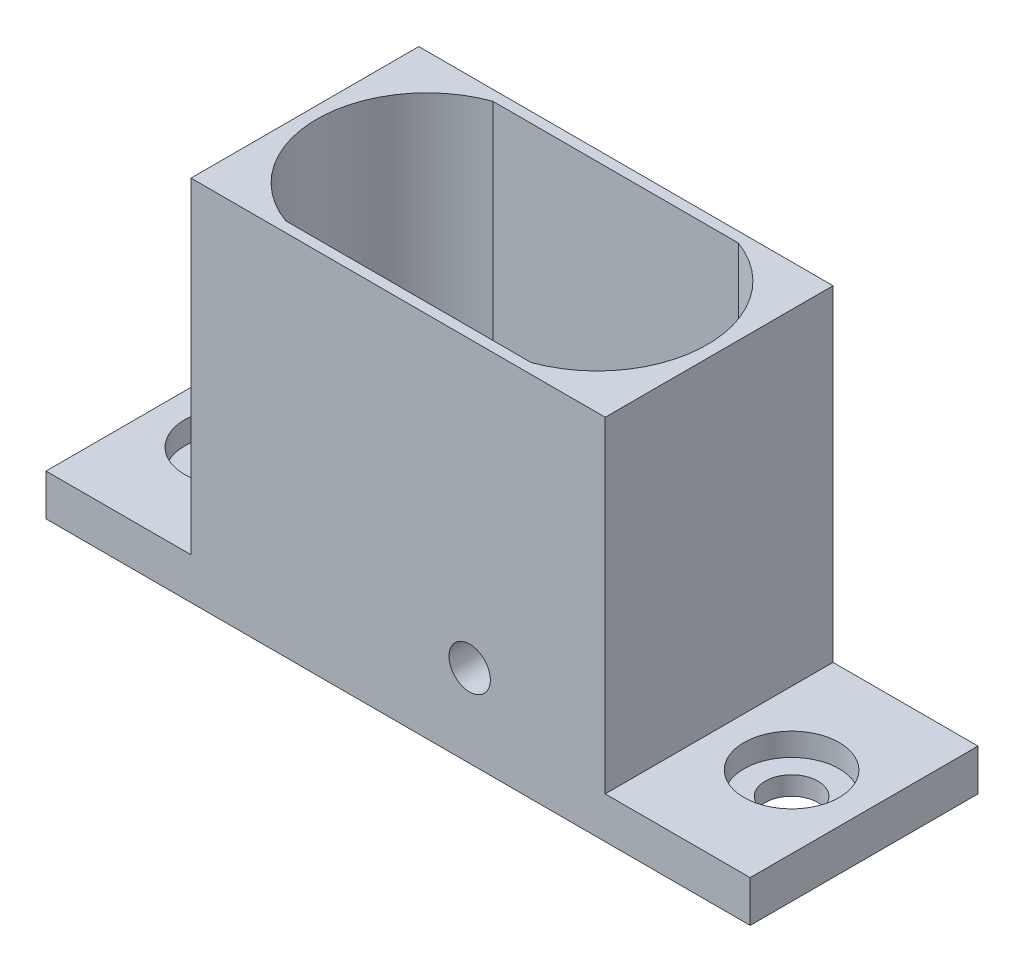
ISO-10303-21;
HEADER;
FILE_DESCRIPTION(('STEP AP214'),'2;1');
FILE_NAME('part.step','',(''),(''),'','','');
FILE_SCHEMA(('AUTOMOTIVE_DESIGN { 1 0 10303 214 1 1 1 1 }'));
ENDSEC;
DATA;
#1=APPLICATION_CONTEXT('core data for automotive mechanical design processes');
#2=APPLICATION_PROTOCOL_DEFINITION('international standard','automotive_design',2000,#1);
#3=PRODUCT_CONTEXT('',#1,'mechanical');
#4=PRODUCT('Part','Part','',(#3));
#5=PRODUCT_RELATED_PRODUCT_CATEGORY('part','',(#4));
#6=PRODUCT_DEFINITION_FORMATION('','',#4);
#7=PRODUCT_DEFINITION_CONTEXT('part definition',#1,'design');
#8=PRODUCT_DEFINITION('design','',#6,#7);
#9=PRODUCT_DEFINITION_SHAPE('','',#8);
#10=(LENGTH_UNIT() NAMED_UNIT(*) SI_UNIT(.MILLI.,.METRE.));
#11=(NAMED_UNIT(*) PLANE_ANGLE_UNIT() SI_UNIT($,.RADIAN.));
#12=(NAMED_UNIT(*) SI_UNIT($,.STERADIAN.) SOLID_ANGLE_UNIT());
#13=UNCERTAINTY_MEASURE_WITH_UNIT(LENGTH_MEASURE(1.E-05),#10,'distance_accuracy_value','');
#14=(GEOMETRIC_REPRESENTATION_CONTEXT(3) GLOBAL_UNCERTAINTY_ASSIGNED_CONTEXT((#13)) GLOBAL_UNIT_ASSIGNED_CONTEXT((#10,
#11,#12)) REPRESENTATION_CONTEXT('',''));
#15=CARTESIAN_POINT('',(0.,0.,0.));
#16=DIRECTION('',(0.,0.,1.));
#17=DIRECTION('',(1.,0.,0.));
#18=AXIS2_PLACEMENT_3D('',#15,#16,#17);
#19=CARTESIAN_POINT('',(6.91,-9.77,16.6568542494924));
#20=DIRECTION('',(0.,0.,-1.));
#21=DIRECTION('',(-1.,0.,0.));
#22=AXIS2_PLACEMENT_3D('',#19,#20,#21);
#23=CYLINDRICAL_SURFACE('',#22,2.);
#24=CARTESIAN_POINT('',(6.91,-9.77,-4.6));
#25=DIRECTION('',(0.,0.,1.));
#26=DIRECTION('',(1.,0.,0.));
#27=AXIS2_PLACEMENT_3D('',#24,#25,#26);
#28=CIRCLE('',#27,2.);
#29=CARTESIAN_POINT('',(8.91,-9.77,-4.6));
#30=VERTEX_POINT('',#29);
#31=EDGE_CURVE('E353',#30,#30,#28,.T.);
#32=ORIENTED_EDGE('',*,*,#31,.T.);
#33=EDGE_LOOP('',(#32));
#34=FACE_BOUND('',#33,.T.);
#35=CARTESIAN_POINT('',(6.91,-9.77,-8.5));
#36=DIRECTION('',(0.,0.,-1.));
#37=DIRECTION('',(-1.,0.,0.));
#38=AXIS2_PLACEMENT_3D('',#35,#36,#37);
#39=CIRCLE('',#38,2.);
#40=CARTESIAN_POINT('',(4.91,-9.77,-8.5));
#41=VERTEX_POINT('',#40);
#42=EDGE_CURVE('E91',#41,#41,#39,.F.);
#43=ORIENTED_EDGE('',*,*,#42,.F.);
#44=EDGE_LOOP('',(#43));
#45=FACE_BOUND('',#44,.T.);
#46=ADVANCED_FACE('F87',(#34,#45),#23,.F.);
#47=CARTESIAN_POINT('',(0.,17.75,0.));
#48=DIRECTION('',(0.,1.,0.));
#49=DIRECTION('',(0.,0.,1.));
#50=AXIS2_PLACEMENT_3D('',#47,#48,#49);
#51=PLANE('',#50);
#52=DIRECTION('',(0.,0.,-1.));
#53=VECTOR('',#52,1.);
#54=CARTESIAN_POINT('',(-20.,17.75,0.));
#55=LINE('',#54,#53);
#56=CARTESIAN_POINT('',(-20.,17.75,11.));
#57=VERTEX_POINT('',#56);
#58=CARTESIAN_POINT('',(-20.,17.75,-11.));
#59=VERTEX_POINT('',#58);
#60=EDGE_CURVE('E294',#57,#59,#55,.T.);
#61=ORIENTED_EDGE('',*,*,#60,.F.);
#62=DIRECTION('',(1.,0.,0.));
#63=VECTOR('',#62,1.);
#64=CARTESIAN_POINT('',(0.,17.75,11.));
#65=LINE('',#64,#63);
#66=CARTESIAN_POINT('',(20.,17.75,11.));
#67=VERTEX_POINT('',#66);
#68=EDGE_CURVE('E326',#57,#67,#65,.T.);
#69=ORIENTED_EDGE('',*,*,#68,.T.);
#70=DIRECTION('',(0.,0.,-1.));
#71=VECTOR('',#70,1.);
#72=CARTESIAN_POINT('',(20.,17.75,0.));
#73=LINE('',#72,#71);
#74=CARTESIAN_POINT('',(20.,17.75,-11.));
#75=VERTEX_POINT('',#74);
#76=EDGE_CURVE('E280',#67,#75,#73,.T.);
#77=ORIENTED_EDGE('',*,*,#76,.T.);
#78=DIRECTION('',(1.,0.,0.));
#79=VECTOR('',#78,1.);
#80=CARTESIAN_POINT('',(0.,17.75,-11.));
#81=LINE('',#80,#79);
#82=EDGE_CURVE('E329',#59,#75,#81,.T.);
#83=ORIENTED_EDGE('',*,*,#82,.F.);
#84=EDGE_LOOP('',(#61,#69,#77,#83));
#85=FACE_BOUND('',#84,.T.);
#86=CARTESIAN_POINT('',(8.22,17.75,0.));
#87=DIRECTION('',(0.,1.,0.));
#88=DIRECTION('',(0.,0.,1.));
#89=AXIS2_PLACEMENT_3D('',#86,#87,#88);
#90=CIRCLE('',#89,10.64);
#91=CARTESIAN_POINT('',(11.8545013413122,17.75,10.));
#92=VERTEX_POINT('',#91);
#93=CARTESIAN_POINT('',(11.8545013413122,17.75,-10.));
#94=VERTEX_POINT('',#93);
#95=EDGE_CURVE('E245',#92,#94,#90,.T.);
#96=ORIENTED_EDGE('',*,*,#95,.F.);
#97=DIRECTION('',(-1.,0.,0.));
#98=VECTOR('',#97,1.);
#99=CARTESIAN_POINT('',(0.,17.75,9.99999999999999));
#100=LINE('',#99,#98);
#101=CARTESIAN_POINT('',(-11.8545013413122,17.75,9.99999999999999));
#102=VERTEX_POINT('',#101);
#103=EDGE_CURVE('E112',#92,#102,#100,.T.);
#104=ORIENTED_EDGE('',*,*,#103,.T.);
#105=CARTESIAN_POINT('',(-8.22,17.75,0.));
#106=DIRECTION('',(0.,1.,0.));
#107=DIRECTION('',(0.,0.,1.));
#108=AXIS2_PLACEMENT_3D('',#105,#106,#107);
#109=CIRCLE('',#108,10.64);
#110=CARTESIAN_POINT('',(-11.8545013413122,17.75,-10.));
#111=VERTEX_POINT('',#110);
#112=EDGE_CURVE('E256',#111,#102,#109,.T.);
#113=ORIENTED_EDGE('',*,*,#112,.F.);
#114=DIRECTION('',(-1.,0.,0.));
#115=VECTOR('',#114,1.);
#116=CARTESIAN_POINT('',(0.,17.75,-10.));
#117=LINE('',#116,#115);
#118=EDGE_CURVE('E259',#94,#111,#117,.T.);
#119=ORIENTED_EDGE('',*,*,#118,.F.);
#120=EDGE_LOOP('',(#96,#104,#113,#119));
#121=FACE_BOUND('',#120,.T.);
#122=ADVANCED_FACE('F394',(#85,#121),#51,.T.);
#123=CARTESIAN_POINT('',(-27.,17.75,0.));
#124=DIRECTION('',(0.,-1.,0.));
#125=DIRECTION('',(0.,0.,-1.));
#126=AXIS2_PLACEMENT_3D('',#123,#124,#125);
#127=CYLINDRICAL_SURFACE('',#126,2.55);
#128=CARTESIAN_POINT('',(-27.,-17.75,0.));
#129=DIRECTION('',(0.,1.,0.));
#130=DIRECTION('',(0.,0.,1.));
#131=AXIS2_PLACEMENT_3D('',#128,#129,#130);
#132=CIRCLE('',#131,2.55);
#133=CARTESIAN_POINT('',(-27.,-17.75,2.55));
#134=VERTEX_POINT('',#133);
#135=EDGE_CURVE('E345',#134,#134,#132,.T.);
#136=ORIENTED_EDGE('',*,*,#135,.F.);
#137=EDGE_LOOP('',(#136));
#138=FACE_BOUND('',#137,.T.);
#139=CARTESIAN_POINT('',(-27.,-15.95,0.));
#140=DIRECTION('',(0.,1.,0.));
#141=DIRECTION('',(0.,0.,1.));
#142=AXIS2_PLACEMENT_3D('',#139,#140,#141);
#143=CIRCLE('',#142,2.55);
#144=CARTESIAN_POINT('',(-27.,-15.95,2.55));
#145=VERTEX_POINT('',#144);
#146=EDGE_CURVE('E272',#145,#145,#143,.T.);
#147=ORIENTED_EDGE('',*,*,#146,.T.);
#148=EDGE_LOOP('',(#147));
#149=FACE_BOUND('',#148,.T.);
#150=ADVANCED_FACE('F441',(#138,#149),#127,.F.);
#151=CARTESIAN_POINT('',(27.,17.75,0.));
#152=DIRECTION('',(0.,-1.,0.));
#153=DIRECTION('',(0.,0.,-1.));
#154=AXIS2_PLACEMENT_3D('',#151,#152,#153);
#155=CYLINDRICAL_SURFACE('',#154,2.55);
#156=CARTESIAN_POINT('',(27.,-17.75,0.));
#157=DIRECTION('',(0.,1.,0.));
#158=DIRECTION('',(0.,0.,1.));
#159=AXIS2_PLACEMENT_3D('',#156,#157,#158);
#160=CIRCLE('',#159,2.55);
#161=CARTESIAN_POINT('',(27.,-17.75,2.55));
#162=VERTEX_POINT('',#161);
#163=EDGE_CURVE('E330',#162,#162,#160,.F.);
#164=ORIENTED_EDGE('',*,*,#163,.T.);
#165=EDGE_LOOP('',(#164));
#166=FACE_BOUND('',#165,.T.);
#167=CARTESIAN_POINT('',(27.,-15.95,0.));
#168=DIRECTION('',(0.,1.,0.));
#169=DIRECTION('',(0.,0.,1.));
#170=AXIS2_PLACEMENT_3D('',#167,#168,#169);
#171=CIRCLE('',#170,2.55);
#172=CARTESIAN_POINT('',(27.,-15.95,2.55));
#173=VERTEX_POINT('',#172);
#174=EDGE_CURVE('E271',#173,#173,#171,.T.);
#175=ORIENTED_EDGE('',*,*,#174,.T.);
#176=EDGE_LOOP('',(#175));
#177=FACE_BOUND('',#176,.T.);
#178=ADVANCED_FACE('F624',(#166,#177),#155,.F.);
#179=CARTESIAN_POINT('',(0.,17.75,11.));
#180=DIRECTION('',(0.,0.,-1.));
#181=DIRECTION('',(-1.,0.,0.));
#182=AXIS2_PLACEMENT_3D('',#179,#180,#181);
#183=PLANE('',#182);
#184=CARTESIAN_POINT('',(6.91,-9.77,11.));
#185=DIRECTION('',(0.,0.,-1.));
#186=DIRECTION('',(-1.,0.,0.));
#187=AXIS2_PLACEMENT_3D('',#184,#185,#186);
#188=CIRCLE('',#187,2.);
#189=CARTESIAN_POINT('',(4.91,-9.77,11.));
#190=VERTEX_POINT('',#189);
#191=EDGE_CURVE('E355',#190,#190,#188,.F.);
#192=ORIENTED_EDGE('',*,*,#191,.F.);
#193=EDGE_LOOP('',(#192));
#194=FACE_BOUND('',#193,.T.);
#195=ORIENTED_EDGE('',*,*,#68,.F.);
#196=DIRECTION('',(0.,1.,0.));
#197=VECTOR('',#196,1.);
#198=CARTESIAN_POINT('',(-20.,-13.75,11.));
#199=LINE('',#198,#197);
#200=CARTESIAN_POINT('',(-20.,-13.75,11.));
#201=VERTEX_POINT('',#200);
#202=EDGE_CURVE('E301',#201,#57,#199,.T.);
#203=ORIENTED_EDGE('',*,*,#202,.F.);
#204=DIRECTION('',(-1.,0.,0.));
#205=VECTOR('',#204,1.);
#206=CARTESIAN_POINT('',(0.,-13.75,11.));
#207=LINE('',#206,#205);
#208=CARTESIAN_POINT('',(-34.,-13.75,11.));
#209=VERTEX_POINT('',#208);
#210=EDGE_CURVE('E290',#201,#209,#207,.T.);
#211=ORIENTED_EDGE('',*,*,#210,.T.);
#212=DIRECTION('',(0.,-1.,0.));
#213=VECTOR('',#212,1.);
#214=CARTESIAN_POINT('',(-34.,17.75,11.));
#215=LINE('',#214,#213);
#216=CARTESIAN_POINT('',(-34.,-17.75,11.));
#217=VERTEX_POINT('',#216);
#218=EDGE_CURVE('E333',#209,#217,#215,.T.);
#219=ORIENTED_EDGE('',*,*,#218,.T.);
#220=DIRECTION('',(1.,0.,0.));
#221=VECTOR('',#220,1.);
#222=CARTESIAN_POINT('',(0.,-17.75,11.));
#223=LINE('',#222,#221);
#224=CARTESIAN_POINT('',(34.,-17.75,11.));
#225=VERTEX_POINT('',#224);
#226=EDGE_CURVE('E308',#217,#225,#223,.T.);
#227=ORIENTED_EDGE('',*,*,#226,.T.);
#228=DIRECTION('',(0.,-1.,0.));
#229=VECTOR('',#228,1.);
#230=CARTESIAN_POINT('',(34.,17.75,11.));
#231=LINE('',#230,#229);
#232=CARTESIAN_POINT('',(34.,-13.75,11.));
#233=VERTEX_POINT('',#232);
#234=EDGE_CURVE('E12',#233,#225,#231,.T.);
#235=ORIENTED_EDGE('',*,*,#234,.F.);
#236=DIRECTION('',(-1.,0.,0.));
#237=VECTOR('',#236,1.);
#238=CARTESIAN_POINT('',(0.,-13.75,11.));
#239=LINE('',#238,#237);
#240=CARTESIAN_POINT('',(20.,-13.75,11.));
#241=VERTEX_POINT('',#240);
#242=EDGE_CURVE('E317',#233,#241,#239,.T.);
#243=ORIENTED_EDGE('',*,*,#242,.T.);
#244=DIRECTION('',(0.,1.,0.));
#245=VECTOR('',#244,1.);
#246=CARTESIAN_POINT('',(20.,-13.75,11.));
#247=LINE('',#246,#245);
#248=EDGE_CURVE('E320',#241,#67,#247,.T.);
#249=ORIENTED_EDGE('',*,*,#248,.T.);
#250=EDGE_LOOP('',(#195,#203,#211,#219,#227,#235,#243,#249));
#251=FACE_BOUND('',#250,.T.);
#252=ADVANCED_FACE('F89',(#194,#251),#183,.F.);
#253=CARTESIAN_POINT('',(34.,17.75,0.));
#254=DIRECTION('',(-1.,0.,0.));
#255=DIRECTION('',(0.,0.,1.));
#256=AXIS2_PLACEMENT_3D('',#253,#254,#255);
#257=PLANE('',#256);
#258=DIRECTION('',(0.,0.,1.));
#259=VECTOR('',#258,1.);
#260=CARTESIAN_POINT('',(34.,-13.75,0.));
#261=LINE('',#260,#259);
#262=CARTESIAN_POINT('',(34.,-13.75,-11.));
#263=VERTEX_POINT('',#262);
#264=EDGE_CURVE('E314',#263,#233,#261,.T.);
#265=ORIENTED_EDGE('',*,*,#264,.T.);
#266=ORIENTED_EDGE('',*,*,#234,.T.);
#267=DIRECTION('',(0.,0.,-1.));
#268=VECTOR('',#267,1.);
#269=CARTESIAN_POINT('',(34.,-17.75,0.));
#270=LINE('',#269,#268);
#271=CARTESIAN_POINT('',(34.,-17.75,-11.));
#272=VERTEX_POINT('',#271);
#273=EDGE_CURVE('E336',#225,#272,#270,.T.);
#274=ORIENTED_EDGE('',*,*,#273,.T.);
#275=DIRECTION('',(0.,-1.,0.));
#276=VECTOR('',#275,1.);
#277=CARTESIAN_POINT('',(34.,17.75,-11.));
#278=LINE('',#277,#276);
#279=EDGE_CURVE('E96',#263,#272,#278,.T.);
#280=ORIENTED_EDGE('',*,*,#279,.F.);
#281=EDGE_LOOP('',(#265,#266,#274,#280));
#282=FACE_BOUND('',#281,.T.);
#283=ADVANCED_FACE('F384',(#282),#257,.F.);
#284=CARTESIAN_POINT('',(0.,17.75,-11.));
#285=DIRECTION('',(0.,0.,-1.));
#286=DIRECTION('',(-1.,0.,0.));
#287=AXIS2_PLACEMENT_3D('',#284,#285,#286);
#288=PLANE('',#287);
#289=CARTESIAN_POINT('',(6.91,-9.77,-11.));
#290=DIRECTION('',(0.,0.,-1.));
#291=DIRECTION('',(-1.,0.,0.));
#292=AXIS2_PLACEMENT_3D('',#289,#290,#291);
#293=CIRCLE('',#292,4.125);
#294=CARTESIAN_POINT('',(2.785,-9.77,-11.));
#295=VERTEX_POINT('',#294);
#296=EDGE_CURVE('E365',#295,#295,#293,.T.);
#297=ORIENTED_EDGE('',*,*,#296,.F.);
#298=EDGE_LOOP('',(#297));
#299=FACE_BOUND('',#298,.T.);
#300=DIRECTION('',(0.,1.,0.));
#301=VECTOR('',#300,1.);
#302=CARTESIAN_POINT('',(-20.,-13.75,-11.));
#303=LINE('',#302,#301);
#304=CARTESIAN_POINT('',(-20.,-13.75,-11.));
#305=VERTEX_POINT('',#304);
#306=EDGE_CURVE('E305',#305,#59,#303,.T.);
#307=ORIENTED_EDGE('',*,*,#306,.T.);
#308=ORIENTED_EDGE('',*,*,#82,.T.);
#309=DIRECTION('',(0.,1.,0.));
#310=VECTOR('',#309,1.);
#311=CARTESIAN_POINT('',(20.,-13.75,-11.));
#312=LINE('',#311,#310);
#313=CARTESIAN_POINT('',(20.,-13.75,-11.));
#314=VERTEX_POINT('',#313);
#315=EDGE_CURVE('E303',#314,#75,#312,.T.);
#316=ORIENTED_EDGE('',*,*,#315,.F.);
#317=DIRECTION('',(-1.,0.,0.));
#318=VECTOR('',#317,1.);
#319=CARTESIAN_POINT('',(0.,-13.75,-11.));
#320=LINE('',#319,#318);
#321=EDGE_CURVE('E311',#263,#314,#320,.T.);
#322=ORIENTED_EDGE('',*,*,#321,.F.);
#323=ORIENTED_EDGE('',*,*,#279,.T.);
#324=DIRECTION('',(1.,0.,0.));
#325=VECTOR('',#324,1.);
#326=CARTESIAN_POINT('',(0.,-17.75,-11.));
#327=LINE('',#326,#325);
#328=CARTESIAN_POINT('',(-34.,-17.75,-11.));
#329=VERTEX_POINT('',#328);
#330=EDGE_CURVE('E339',#329,#272,#327,.T.);
#331=ORIENTED_EDGE('',*,*,#330,.F.);
#332=DIRECTION('',(0.,-1.,0.));
#333=VECTOR('',#332,1.);
#334=CARTESIAN_POINT('',(-34.,17.75,-11.));
#335=LINE('',#334,#333);
#336=CARTESIAN_POINT('',(-34.,-13.75,-11.));
#337=VERTEX_POINT('',#336);
#338=EDGE_CURVE('E351',#337,#329,#335,.T.);
#339=ORIENTED_EDGE('',*,*,#338,.F.);
#340=DIRECTION('',(-1.,0.,0.));
#341=VECTOR('',#340,1.);
#342=CARTESIAN_POINT('',(0.,-13.75,-11.));
#343=LINE('',#342,#341);
#344=EDGE_CURVE('E296',#305,#337,#343,.T.);
#345=ORIENTED_EDGE('',*,*,#344,.F.);
#346=EDGE_LOOP('',(#307,#308,#316,#322,#323,#331,#339,#345));
#347=FACE_BOUND('',#346,.T.);
#348=ADVANCED_FACE('F380',(#299,#347),#288,.T.);
#349=CARTESIAN_POINT('',(-34.,17.75,0.));
#350=DIRECTION('',(-1.,0.,0.));
#351=DIRECTION('',(0.,0.,1.));
#352=AXIS2_PLACEMENT_3D('',#349,#350,#351);
#353=PLANE('',#352);
#354=ORIENTED_EDGE('',*,*,#218,.F.);
#355=DIRECTION('',(0.,0.,1.));
#356=VECTOR('',#355,1.);
#357=CARTESIAN_POINT('',(-34.,-13.75,0.));
#358=LINE('',#357,#356);
#359=EDGE_CURVE('E293',#337,#209,#358,.T.);
#360=ORIENTED_EDGE('',*,*,#359,.F.);
#361=ORIENTED_EDGE('',*,*,#338,.T.);
#362=DIRECTION('',(0.,0.,-1.));
#363=VECTOR('',#362,1.);
#364=CARTESIAN_POINT('',(-34.,-17.75,0.));
#365=LINE('',#364,#363);
#366=EDGE_CURVE('E342',#217,#329,#365,.T.);
#367=ORIENTED_EDGE('',*,*,#366,.F.);
#368=EDGE_LOOP('',(#354,#360,#361,#367));
#369=FACE_BOUND('',#368,.T.);
#370=ADVANCED_FACE('F383',(#369),#353,.T.);
#371=CARTESIAN_POINT('',(0.,-17.75,0.));
#372=DIRECTION('',(0.,1.,0.));
#373=DIRECTION('',(0.,0.,1.));
#374=AXIS2_PLACEMENT_3D('',#371,#372,#373);
#375=PLANE('',#374);
#376=ORIENTED_EDGE('',*,*,#226,.F.);
#377=ORIENTED_EDGE('',*,*,#366,.T.);
#378=ORIENTED_EDGE('',*,*,#330,.T.);
#379=ORIENTED_EDGE('',*,*,#273,.F.);
#380=EDGE_LOOP('',(#376,#377,#378,#379));
#381=FACE_BOUND('',#380,.T.);
#382=ORIENTED_EDGE('',*,*,#135,.T.);
#383=EDGE_LOOP('',(#382));
#384=FACE_BOUND('',#383,.T.);
#385=ORIENTED_EDGE('',*,*,#163,.F.);
#386=EDGE_LOOP('',(#385));
#387=FACE_BOUND('',#386,.T.);
#388=ADVANCED_FACE('F413',(#381,#384,#387),#375,.F.);
#389=CARTESIAN_POINT('',(20.,-13.75,0.));
#390=DIRECTION('',(1.,0.,0.));
#391=DIRECTION('',(0.,0.,-1.));
#392=AXIS2_PLACEMENT_3D('',#389,#390,#391);
#393=PLANE('',#392);
#394=ORIENTED_EDGE('',*,*,#76,.F.);
#395=ORIENTED_EDGE('',*,*,#248,.F.);
#396=DIRECTION('',(0.,0.,-1.));
#397=VECTOR('',#396,1.);
#398=CARTESIAN_POINT('',(20.,-13.75,0.));
#399=LINE('',#398,#397);
#400=EDGE_CURVE('E309',#241,#314,#399,.T.);
#401=ORIENTED_EDGE('',*,*,#400,.T.);
#402=ORIENTED_EDGE('',*,*,#315,.T.);
#403=EDGE_LOOP('',(#394,#395,#401,#402));
#404=FACE_BOUND('',#403,.T.);
#405=ADVANCED_FACE('F398',(#404),#393,.T.);
#406=CARTESIAN_POINT('',(0.,-13.75,0.));
#407=DIRECTION('',(0.,1.,0.));
#408=DIRECTION('',(0.,0.,1.));
#409=AXIS2_PLACEMENT_3D('',#406,#407,#408);
#410=PLANE('',#409);
#411=CARTESIAN_POINT('',(27.,-13.75,0.));
#412=DIRECTION('',(0.,1.,0.));
#413=DIRECTION('',(0.,0.,1.));
#414=AXIS2_PLACEMENT_3D('',#411,#412,#413);
#415=CIRCLE('',#414,4.6);
#416=CARTESIAN_POINT('',(27.,-13.75,4.6));
#417=VERTEX_POINT('',#416);
#418=EDGE_CURVE('E285',#417,#417,#415,.T.);
#419=ORIENTED_EDGE('',*,*,#418,.F.);
#420=EDGE_LOOP('',(#419));
#421=FACE_BOUND('',#420,.T.);
#422=ORIENTED_EDGE('',*,*,#400,.F.);
#423=ORIENTED_EDGE('',*,*,#242,.F.);
#424=ORIENTED_EDGE('',*,*,#264,.F.);
#425=ORIENTED_EDGE('',*,*,#321,.T.);
#426=EDGE_LOOP('',(#422,#423,#424,#425));
#427=FACE_BOUND('',#426,.T.);
#428=ADVANCED_FACE('F404',(#421,#427),#410,.T.);
#429=CARTESIAN_POINT('',(-20.,-13.75,0.));
#430=DIRECTION('',(1.,0.,0.));
#431=DIRECTION('',(0.,0.,-1.));
#432=AXIS2_PLACEMENT_3D('',#429,#430,#431);
#433=PLANE('',#432);
#434=ORIENTED_EDGE('',*,*,#60,.T.);
#435=ORIENTED_EDGE('',*,*,#306,.F.);
#436=DIRECTION('',(0.,0.,-1.));
#437=VECTOR('',#436,1.);
#438=CARTESIAN_POINT('',(-20.,-13.75,0.));
#439=LINE('',#438,#437);
#440=EDGE_CURVE('E298',#201,#305,#439,.T.);
#441=ORIENTED_EDGE('',*,*,#440,.F.);
#442=ORIENTED_EDGE('',*,*,#202,.T.);
#443=EDGE_LOOP('',(#434,#435,#441,#442));
#444=FACE_BOUND('',#443,.T.);
#445=ADVANCED_FACE('F420',(#444),#433,.F.);
#446=CARTESIAN_POINT('',(0.,-13.75,0.));
#447=DIRECTION('',(0.,1.,0.));
#448=DIRECTION('',(0.,0.,1.));
#449=AXIS2_PLACEMENT_3D('',#446,#447,#448);
#450=PLANE('',#449);
#451=CARTESIAN_POINT('',(-27.,-13.75,0.));
#452=DIRECTION('',(0.,1.,0.));
#453=DIRECTION('',(0.,0.,1.));
#454=AXIS2_PLACEMENT_3D('',#451,#452,#453);
#455=CIRCLE('',#454,4.6);
#456=CARTESIAN_POINT('',(-27.,-13.75,4.6));
#457=VERTEX_POINT('',#456);
#458=EDGE_CURVE('E275',#457,#457,#455,.T.);
#459=ORIENTED_EDGE('',*,*,#458,.F.);
#460=EDGE_LOOP('',(#459));
#461=FACE_BOUND('',#460,.T.);
#462=ORIENTED_EDGE('',*,*,#210,.F.);
#463=ORIENTED_EDGE('',*,*,#440,.T.);
#464=ORIENTED_EDGE('',*,*,#344,.T.);
#465=ORIENTED_EDGE('',*,*,#359,.T.);
#466=EDGE_LOOP('',(#462,#463,#464,#465));
#467=FACE_BOUND('',#466,.T.);
#468=ADVANCED_FACE('F419',(#461,#467),#450,.T.);
#469=CARTESIAN_POINT('',(-27.,-15.95,0.));
#470=DIRECTION('',(0.,1.,0.));
#471=DIRECTION('',(0.,0.,1.));
#472=AXIS2_PLACEMENT_3D('',#469,#470,#471);
#473=CYLINDRICAL_SURFACE('',#472,4.6);
#474=CARTESIAN_POINT('',(-27.,-15.95,0.));
#475=DIRECTION('',(0.,1.,0.));
#476=DIRECTION('',(0.,0.,1.));
#477=AXIS2_PLACEMENT_3D('',#474,#475,#476);
#478=CIRCLE('',#477,4.6);
#479=CARTESIAN_POINT('',(-27.,-15.95,4.6));
#480=VERTEX_POINT('',#479);
#481=EDGE_CURVE('E277',#480,#480,#478,.T.);
#482=ORIENTED_EDGE('',*,*,#481,.F.);
#483=EDGE_LOOP('',(#482));
#484=FACE_BOUND('',#483,.T.);
#485=ORIENTED_EDGE('',*,*,#458,.T.);
#486=EDGE_LOOP('',(#485));
#487=FACE_BOUND('',#486,.T.);
#488=ADVANCED_FACE('F428',(#484,#487),#473,.F.);
#489=CARTESIAN_POINT('',(-27.,-15.95,0.));
#490=DIRECTION('',(0.,1.,0.));
#491=DIRECTION('',(0.,0.,1.));
#492=AXIS2_PLACEMENT_3D('',#489,#490,#491);
#493=PLANE('',#492);
#494=ORIENTED_EDGE('',*,*,#146,.F.);
#495=EDGE_LOOP('',(#494));
#496=FACE_BOUND('',#495,.T.);
#497=ORIENTED_EDGE('',*,*,#481,.T.);
#498=EDGE_LOOP('',(#497));
#499=FACE_BOUND('',#498,.T.);
#500=ADVANCED_FACE('F492',(#496,#499),#493,.T.);
#501=CARTESIAN_POINT('',(27.,-15.95,0.));
#502=DIRECTION('',(0.,1.,0.));
#503=DIRECTION('',(0.,0.,1.));
#504=AXIS2_PLACEMENT_3D('',#501,#502,#503);
#505=CYLINDRICAL_SURFACE('',#504,4.6);
#506=CARTESIAN_POINT('',(27.,-15.95,0.));
#507=DIRECTION('',(0.,1.,0.));
#508=DIRECTION('',(0.,0.,1.));
#509=AXIS2_PLACEMENT_3D('',#506,#507,#508);
#510=CIRCLE('',#509,4.6);
#511=CARTESIAN_POINT('',(27.,-15.95,4.6));
#512=VERTEX_POINT('',#511);
#513=EDGE_CURVE('E276',#512,#512,#510,.T.);
#514=ORIENTED_EDGE('',*,*,#513,.F.);
#515=EDGE_LOOP('',(#514));
#516=FACE_BOUND('',#515,.T.);
#517=ORIENTED_EDGE('',*,*,#418,.T.);
#518=EDGE_LOOP('',(#517));
#519=FACE_BOUND('',#518,.T.);
#520=ADVANCED_FACE('F495',(#516,#519),#505,.F.);
#521=CARTESIAN_POINT('',(27.,-15.95,0.));
#522=DIRECTION('',(0.,1.,0.));
#523=DIRECTION('',(0.,0.,1.));
#524=AXIS2_PLACEMENT_3D('',#521,#522,#523);
#525=PLANE('',#524);
#526=ORIENTED_EDGE('',*,*,#174,.F.);
#527=EDGE_LOOP('',(#526));
#528=FACE_BOUND('',#527,.T.);
#529=ORIENTED_EDGE('',*,*,#513,.T.);
#530=EDGE_LOOP('',(#529));
#531=FACE_BOUND('',#530,.T.);
#532=ADVANCED_FACE('F491',(#528,#531),#525,.T.);
#533=CARTESIAN_POINT('',(0.,-5.25,9.99999999999999));
#534=DIRECTION('',(0.,0.,-1.));
#535=DIRECTION('',(-1.,0.,0.));
#536=AXIS2_PLACEMENT_3D('',#533,#534,#535);
#537=PLANE('',#536);
#538=ORIENTED_EDGE('',*,*,#103,.F.);
#539=DIRECTION('',(0.,1.,0.));
#540=VECTOR('',#539,1.);
#541=CARTESIAN_POINT('',(11.8545013413122,-5.25,10.));
#542=LINE('',#541,#540);
#543=CARTESIAN_POINT('',(11.8545013413122,-5.25,10.));
#544=VERTEX_POINT('',#543);
#545=EDGE_CURVE('E254',#544,#92,#542,.T.);
#546=ORIENTED_EDGE('',*,*,#545,.F.);
#547=DIRECTION('',(-1.,0.,0.));
#548=VECTOR('',#547,1.);
#549=CARTESIAN_POINT('',(0.,-5.25,9.99999999999999));
#550=LINE('',#549,#548);
#551=CARTESIAN_POINT('',(-11.8545013413122,-5.25,9.99999999999999));
#552=VERTEX_POINT('',#551);
#553=EDGE_CURVE('E242',#544,#552,#550,.T.);
#554=ORIENTED_EDGE('',*,*,#553,.T.);
#555=DIRECTION('',(0.,1.,0.));
#556=VECTOR('',#555,1.);
#557=CARTESIAN_POINT('',(-11.8545013413122,-5.25,9.99999999999999));
#558=LINE('',#557,#556);
#559=EDGE_CURVE('E269',#552,#102,#558,.T.);
#560=ORIENTED_EDGE('',*,*,#559,.T.);
#561=EDGE_LOOP('',(#538,#546,#554,#560));
#562=FACE_BOUND('',#561,.T.);
#563=ADVANCED_FACE('F487',(#562),#537,.T.);
#564=CARTESIAN_POINT('',(-8.22,-5.25,0.));
#565=DIRECTION('',(0.,1.,0.));
#566=DIRECTION('',(0.,0.,1.));
#567=AXIS2_PLACEMENT_3D('',#564,#565,#566);
#568=CYLINDRICAL_SURFACE('',#567,10.64);
#569=ORIENTED_EDGE('',*,*,#112,.T.);
#570=ORIENTED_EDGE('',*,*,#559,.F.);
#571=CARTESIAN_POINT('',(-8.22,-5.25,0.));
#572=DIRECTION('',(0.,1.,0.));
#573=DIRECTION('',(0.,0.,1.));
#574=AXIS2_PLACEMENT_3D('',#571,#572,#573);
#575=CIRCLE('',#574,10.64);
#576=CARTESIAN_POINT('',(-11.8545013413122,-5.25,-10.));
#577=VERTEX_POINT('',#576);
#578=EDGE_CURVE('E244',#577,#552,#575,.T.);
#579=ORIENTED_EDGE('',*,*,#578,.F.);
#580=DIRECTION('',(0.,1.,0.));
#581=VECTOR('',#580,1.);
#582=CARTESIAN_POINT('',(-11.8545013413122,-5.25,-10.));
#583=LINE('',#582,#581);
#584=EDGE_CURVE('E267',#577,#111,#583,.T.);
#585=ORIENTED_EDGE('',*,*,#584,.T.);
#586=EDGE_LOOP('',(#569,#570,#579,#585));
#587=FACE_BOUND('',#586,.T.);
#588=ADVANCED_FACE('F483',(#587),#568,.F.);
#589=CARTESIAN_POINT('',(0.,-5.25,-10.));
#590=DIRECTION('',(0.,0.,-1.));
#591=DIRECTION('',(-1.,0.,0.));
#592=AXIS2_PLACEMENT_3D('',#589,#590,#591);
#593=PLANE('',#592);
#594=ORIENTED_EDGE('',*,*,#118,.T.);
#595=ORIENTED_EDGE('',*,*,#584,.F.);
#596=DIRECTION('',(-1.,0.,0.));
#597=VECTOR('',#596,1.);
#598=CARTESIAN_POINT('',(0.,-5.25,-10.));
#599=LINE('',#598,#597);
#600=CARTESIAN_POINT('',(11.8545013413122,-5.25,-10.));
#601=VERTEX_POINT('',#600);
#602=EDGE_CURVE('E248',#601,#577,#599,.T.);
#603=ORIENTED_EDGE('',*,*,#602,.F.);
#604=DIRECTION('',(0.,1.,0.));
#605=VECTOR('',#604,1.);
#606=CARTESIAN_POINT('',(11.8545013413122,-5.25,-10.));
#607=LINE('',#606,#605);
#608=EDGE_CURVE('E265',#601,#94,#607,.T.);
#609=ORIENTED_EDGE('',*,*,#608,.T.);
#610=EDGE_LOOP('',(#594,#595,#603,#609));
#611=FACE_BOUND('',#610,.T.);
#612=ADVANCED_FACE('F479',(#611),#593,.F.);
#613=CARTESIAN_POINT('',(8.22,-5.25,0.));
#614=DIRECTION('',(0.,1.,0.));
#615=DIRECTION('',(0.,0.,1.));
#616=AXIS2_PLACEMENT_3D('',#613,#614,#615);
#617=CYLINDRICAL_SURFACE('',#616,10.64);
#618=ORIENTED_EDGE('',*,*,#95,.T.);
#619=ORIENTED_EDGE('',*,*,#608,.F.);
#620=CARTESIAN_POINT('',(8.22,-5.25,0.));
#621=DIRECTION('',(0.,1.,0.));
#622=DIRECTION('',(0.,0.,1.));
#623=AXIS2_PLACEMENT_3D('',#620,#621,#622);
#624=CIRCLE('',#623,10.64);
#625=EDGE_CURVE('E251',#544,#601,#624,.T.);
#626=ORIENTED_EDGE('',*,*,#625,.F.);
#627=ORIENTED_EDGE('',*,*,#545,.T.);
#628=EDGE_LOOP('',(#618,#619,#626,#627));
#629=FACE_BOUND('',#628,.T.);
#630=ADVANCED_FACE('F476',(#629),#617,.F.);
#631=CARTESIAN_POINT('',(-8.22,-5.25,0.));
#632=DIRECTION('',(0.,1.,0.));
#633=DIRECTION('',(0.,0.,1.));
#634=AXIS2_PLACEMENT_3D('',#631,#632,#633);
#635=PLANE('',#634);
#636=DIRECTION('',(0.,0.,-1.));
#637=VECTOR('',#636,1.);
#638=CARTESIAN_POINT('',(12.92918915,-5.25,0.));
#639=LINE('',#638,#637);
#640=CARTESIAN_POINT('',(12.92918915,-5.25,4.6));
#641=VERTEX_POINT('',#640);
#642=CARTESIAN_POINT('',(12.92918915,-5.25,-4.6));
#643=VERTEX_POINT('',#642);
#644=EDGE_CURVE('E104',#641,#643,#639,.T.);
#645=ORIENTED_EDGE('',*,*,#644,.F.);
#646=DIRECTION('',(1.,0.,0.));
#647=VECTOR('',#646,1.);
#648=CARTESIAN_POINT('',(-8.22,-5.25,4.6));
#649=LINE('',#648,#647);
#650=CARTESIAN_POINT('',(0.929189150000001,-5.25,4.6));
#651=VERTEX_POINT('',#650);
#652=EDGE_CURVE('E221',#651,#641,#649,.T.);
#653=ORIENTED_EDGE('',*,*,#652,.F.);
#654=DIRECTION('',(0.,0.,-1.));
#655=VECTOR('',#654,1.);
#656=CARTESIAN_POINT('',(0.929189150000001,-5.25,0.));
#657=LINE('',#656,#655);
#658=CARTESIAN_POINT('',(0.929189150000001,-5.25,-4.6));
#659=VERTEX_POINT('',#658);
#660=EDGE_CURVE('E224',#651,#659,#657,.T.);
#661=ORIENTED_EDGE('',*,*,#660,.T.);
#662=DIRECTION('',(1.,0.,0.));
#663=VECTOR('',#662,1.);
#664=CARTESIAN_POINT('',(-8.22,-5.25,-4.6));
#665=LINE('',#664,#663);
#666=EDGE_CURVE('E233',#659,#643,#665,.T.);
#667=ORIENTED_EDGE('',*,*,#666,.T.);
#668=EDGE_LOOP('',(#645,#653,#661,#667));
#669=FACE_BOUND('',#668,.T.);
#670=ORIENTED_EDGE('',*,*,#553,.F.);
#671=ORIENTED_EDGE('',*,*,#625,.T.);
#672=ORIENTED_EDGE('',*,*,#602,.T.);
#673=ORIENTED_EDGE('',*,*,#578,.T.);
#674=EDGE_LOOP('',(#670,#671,#672,#673));
#675=FACE_BOUND('',#674,.T.);
#676=ADVANCED_FACE('F462',(#669,#675),#635,.T.);
#677=CARTESIAN_POINT('',(12.92918915,-14.25,0.));
#678=DIRECTION('',(1.,0.,0.));
#679=DIRECTION('',(0.,0.,-1.));
#680=AXIS2_PLACEMENT_3D('',#677,#678,#679);
#681=PLANE('',#680);
#682=ORIENTED_EDGE('',*,*,#644,.T.);
#683=DIRECTION('',(0.,1.,0.));
#684=VECTOR('',#683,1.);
#685=CARTESIAN_POINT('',(12.92918915,-14.25,-4.6));
#686=LINE('',#685,#684);
#687=CARTESIAN_POINT('',(12.92918915,-14.25,-4.6));
#688=VERTEX_POINT('',#687);
#689=EDGE_CURVE('E205',#688,#643,#686,.T.);
#690=ORIENTED_EDGE('',*,*,#689,.F.);
#691=DIRECTION('',(0.,0.,-1.));
#692=VECTOR('',#691,1.);
#693=CARTESIAN_POINT('',(12.92918915,-14.25,0.));
#694=LINE('',#693,#692);
#695=CARTESIAN_POINT('',(12.92918915,-14.25,4.6));
#696=VERTEX_POINT('',#695);
#697=EDGE_CURVE('E212',#696,#688,#694,.T.);
#698=ORIENTED_EDGE('',*,*,#697,.F.);
#699=DIRECTION('',(0.,1.,0.));
#700=VECTOR('',#699,1.);
#701=CARTESIAN_POINT('',(12.92918915,-14.25,4.6));
#702=LINE('',#701,#700);
#703=EDGE_CURVE('E237',#696,#641,#702,.T.);
#704=ORIENTED_EDGE('',*,*,#703,.T.);
#705=EDGE_LOOP('',(#682,#690,#698,#704));
#706=FACE_BOUND('',#705,.T.);
#707=ADVANCED_FACE('F215',(#706),#681,.F.);
#708=CARTESIAN_POINT('',(-8.22,-14.25,4.6));
#709=DIRECTION('',(0.,0.,1.));
#710=DIRECTION('',(1.,0.,0.));
#711=AXIS2_PLACEMENT_3D('',#708,#709,#710);
#712=PLANE('',#711);
#713=CARTESIAN_POINT('',(6.91,-9.77,4.6));
#714=DIRECTION('',(0.,0.,1.));
#715=DIRECTION('',(1.,0.,0.));
#716=AXIS2_PLACEMENT_3D('',#713,#714,#715);
#717=CIRCLE('',#716,2.);
#718=CARTESIAN_POINT('',(8.91,-9.77,4.6));
#719=VERTEX_POINT('',#718);
#720=EDGE_CURVE('E227',#719,#719,#717,.T.);
#721=ORIENTED_EDGE('',*,*,#720,.T.);
#722=EDGE_LOOP('',(#721));
#723=FACE_BOUND('',#722,.T.);
#724=ORIENTED_EDGE('',*,*,#652,.T.);
#725=ORIENTED_EDGE('',*,*,#703,.F.);
#726=DIRECTION('',(1.,0.,0.));
#727=VECTOR('',#726,1.);
#728=CARTESIAN_POINT('',(-8.22,-14.25,4.6));
#729=LINE('',#728,#727);
#730=CARTESIAN_POINT('',(0.929189150000001,-14.25,4.6));
#731=VERTEX_POINT('',#730);
#732=EDGE_CURVE('E217',#731,#696,#729,.T.);
#733=ORIENTED_EDGE('',*,*,#732,.F.);
#734=DIRECTION('',(0.,1.,0.));
#735=VECTOR('',#734,1.);
#736=CARTESIAN_POINT('',(0.929189150000001,-14.25,4.6));
#737=LINE('',#736,#735);
#738=EDGE_CURVE('E239',#731,#651,#737,.T.);
#739=ORIENTED_EDGE('',*,*,#738,.T.);
#740=EDGE_LOOP('',(#724,#725,#733,#739));
#741=FACE_BOUND('',#740,.T.);
#742=ADVANCED_FACE('F454',(#723,#741),#712,.F.);
#743=CARTESIAN_POINT('',(0.929189150000001,-14.25,0.));
#744=DIRECTION('',(1.,0.,0.));
#745=DIRECTION('',(0.,0.,-1.));
#746=AXIS2_PLACEMENT_3D('',#743,#744,#745);
#747=PLANE('',#746);
#748=ORIENTED_EDGE('',*,*,#660,.F.);
#749=ORIENTED_EDGE('',*,*,#738,.F.);
#750=DIRECTION('',(0.,0.,-1.));
#751=VECTOR('',#750,1.);
#752=CARTESIAN_POINT('',(0.929189150000001,-14.25,0.));
#753=LINE('',#752,#751);
#754=CARTESIAN_POINT('',(0.929189150000001,-14.25,-4.6));
#755=VERTEX_POINT('',#754);
#756=EDGE_CURVE('E211',#731,#755,#753,.T.);
#757=ORIENTED_EDGE('',*,*,#756,.T.);
#758=DIRECTION('',(0.,1.,0.));
#759=VECTOR('',#758,1.);
#760=CARTESIAN_POINT('',(0.929189150000001,-14.25,-4.6));
#761=LINE('',#760,#759);
#762=EDGE_CURVE('E207',#755,#659,#761,.T.);
#763=ORIENTED_EDGE('',*,*,#762,.T.);
#764=EDGE_LOOP('',(#748,#749,#757,#763));
#765=FACE_BOUND('',#764,.T.);
#766=ADVANCED_FACE('F457',(#765),#747,.T.);
#767=CARTESIAN_POINT('',(-8.22,-14.25,-4.6));
#768=DIRECTION('',(0.,0.,1.));
#769=DIRECTION('',(1.,0.,0.));
#770=AXIS2_PLACEMENT_3D('',#767,#768,#769);
#771=PLANE('',#770);
#772=ORIENTED_EDGE('',*,*,#31,.F.);
#773=EDGE_LOOP('',(#772));
#774=FACE_BOUND('',#773,.T.);
#775=ORIENTED_EDGE('',*,*,#666,.F.);
#776=ORIENTED_EDGE('',*,*,#762,.F.);
#777=DIRECTION('',(1.,0.,0.));
#778=VECTOR('',#777,1.);
#779=CARTESIAN_POINT('',(-8.22,-14.25,-4.6));
#780=LINE('',#779,#778);
#781=EDGE_CURVE('E202',#755,#688,#780,.T.);
#782=ORIENTED_EDGE('',*,*,#781,.T.);
#783=ORIENTED_EDGE('',*,*,#689,.T.);
#784=EDGE_LOOP('',(#775,#776,#782,#783));
#785=FACE_BOUND('',#784,.T.);
#786=ADVANCED_FACE('F204',(#774,#785),#771,.T.);
#787=CARTESIAN_POINT('',(0.,-14.25,0.));
#788=DIRECTION('',(0.,-1.,0.));
#789=DIRECTION('',(0.,0.,-1.));
#790=AXIS2_PLACEMENT_3D('',#787,#788,#789);
#791=PLANE('',#790);
#792=ORIENTED_EDGE('',*,*,#697,.T.);
#793=ORIENTED_EDGE('',*,*,#781,.F.);
#794=ORIENTED_EDGE('',*,*,#756,.F.);
#795=ORIENTED_EDGE('',*,*,#732,.T.);
#796=EDGE_LOOP('',(#792,#793,#794,#795));
#797=FACE_BOUND('',#796,.T.);
#798=ADVANCED_FACE('F219',(#797),#791,.F.);
#799=ORIENTED_EDGE('',*,*,#191,.T.);
#800=EDGE_LOOP('',(#799));
#801=FACE_BOUND('',#800,.T.);
#802=ORIENTED_EDGE('',*,*,#720,.F.);
#803=EDGE_LOOP('',(#802));
#804=FACE_BOUND('',#803,.T.);
#805=ADVANCED_FACE('F436',(#801,#804),#23,.F.);
#806=CARTESIAN_POINT('',(6.91,-9.77,-8.5));
#807=DIRECTION('',(0.,0.,-1.));
#808=DIRECTION('',(-1.,0.,0.));
#809=AXIS2_PLACEMENT_3D('',#806,#807,#808);
#810=PLANE('',#809);
#811=CARTESIAN_POINT('',(6.91,-9.77,-8.5));
#812=DIRECTION('',(0.,0.,-1.));
#813=DIRECTION('',(-1.,0.,0.));
#814=AXIS2_PLACEMENT_3D('',#811,#812,#813);
#815=CIRCLE('',#814,4.125);
#816=CARTESIAN_POINT('',(2.785,-9.77,-8.5));
#817=VERTEX_POINT('',#816);
#818=EDGE_CURVE('E363',#817,#817,#815,.T.);
#819=ORIENTED_EDGE('',*,*,#818,.T.);
#820=EDGE_LOOP('',(#819));
#821=FACE_BOUND('',#820,.T.);
#822=ORIENTED_EDGE('',*,*,#42,.T.);
#823=EDGE_LOOP('',(#822));
#824=FACE_BOUND('',#823,.T.);
#825=ADVANCED_FACE('F371',(#821,#824),#810,.T.);
#826=CARTESIAN_POINT('',(6.91,-9.77,-8.5));
#827=DIRECTION('',(0.,0.,-1.));
#828=DIRECTION('',(-1.,0.,0.));
#829=AXIS2_PLACEMENT_3D('',#826,#827,#828);
#830=CYLINDRICAL_SURFACE('',#829,4.125);
#831=ORIENTED_EDGE('',*,*,#818,.F.);
#832=EDGE_LOOP('',(#831));
#833=FACE_BOUND('',#832,.T.);
#834=ORIENTED_EDGE('',*,*,#296,.T.);
#835=EDGE_LOOP('',(#834));
#836=FACE_BOUND('',#835,.T.);
#837=ADVANCED_FACE('F374',(#833,#836),#830,.F.);
#838=CLOSED_SHELL('',(#46,#122,#150,#178,#252,#283,#348,#370,#388,#405,#428,#445,#468,#488,#500,
#520,#532,#563,#588,#612,#630,#676,#707,#742,#766,#786,#798,#805,#825,#837));
#839=MANIFOLD_SOLID_BREP('B2',#838);
#840=ADVANCED_BREP_SHAPE_REPRESENTATION('',(#18,#839),#14);
#841=SHAPE_DEFINITION_REPRESENTATION(#9,#840);
ENDSEC;
END-ISO-10303-21;
